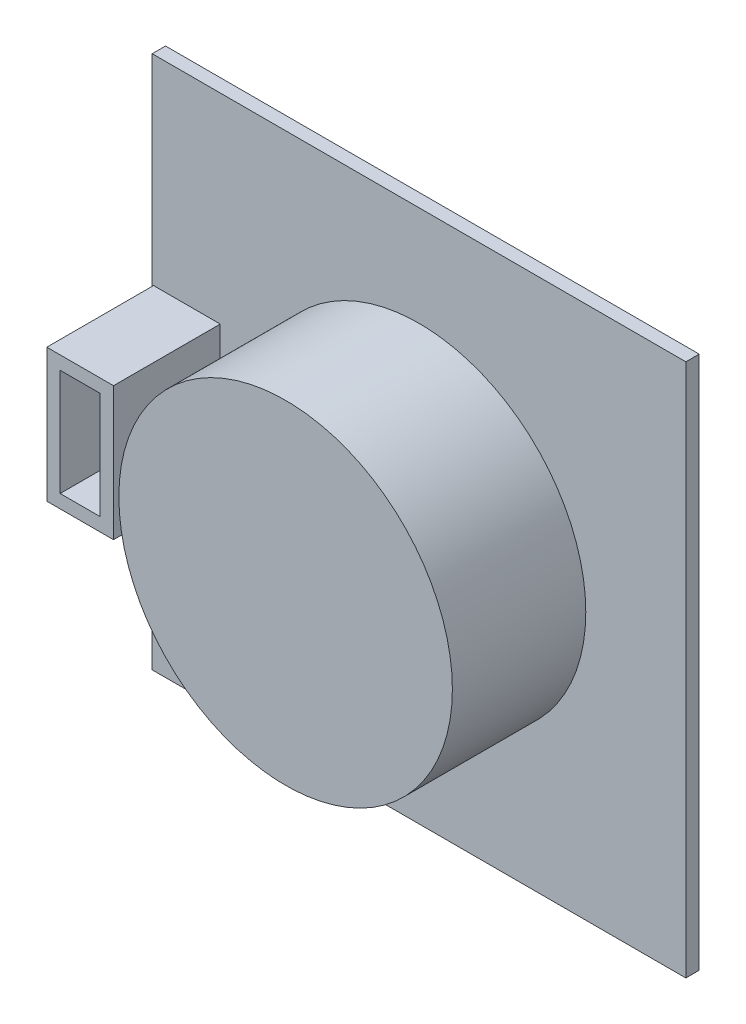
ISO-10303-21;
HEADER;
FILE_DESCRIPTION(('STEP AP214'),'2;1');
FILE_NAME('part.step','',(''),(''),'','','');
FILE_SCHEMA(('AUTOMOTIVE_DESIGN { 1 0 10303 214 1 1 1 1 }'));
ENDSEC;
DATA;
#1=APPLICATION_CONTEXT('core data for automotive mechanical design processes');
#2=APPLICATION_PROTOCOL_DEFINITION('international standard','automotive_design',2000,#1);
#3=PRODUCT_CONTEXT('',#1,'mechanical');
#4=PRODUCT('Part','Part','',(#3));
#5=PRODUCT_RELATED_PRODUCT_CATEGORY('part','',(#4));
#6=PRODUCT_DEFINITION_FORMATION('','',#4);
#7=PRODUCT_DEFINITION_CONTEXT('part definition',#1,'design');
#8=PRODUCT_DEFINITION('design','',#6,#7);
#9=PRODUCT_DEFINITION_SHAPE('','',#8);
#10=(LENGTH_UNIT() NAMED_UNIT(*) SI_UNIT(.MILLI.,.METRE.));
#11=(NAMED_UNIT(*) PLANE_ANGLE_UNIT() SI_UNIT($,.RADIAN.));
#12=(NAMED_UNIT(*) SI_UNIT($,.STERADIAN.) SOLID_ANGLE_UNIT());
#13=UNCERTAINTY_MEASURE_WITH_UNIT(LENGTH_MEASURE(1.E-05),#10,'distance_accuracy_value','');
#14=(GEOMETRIC_REPRESENTATION_CONTEXT(3) GLOBAL_UNCERTAINTY_ASSIGNED_CONTEXT((#13)) GLOBAL_UNIT_ASSIGNED_CONTEXT((#10,
#11,#12)) REPRESENTATION_CONTEXT('',''));
#15=CARTESIAN_POINT('',(0.,0.,0.));
#16=DIRECTION('',(0.,0.,1.));
#17=DIRECTION('',(1.,0.,0.));
#18=AXIS2_PLACEMENT_3D('',#15,#16,#17);
#19=CARTESIAN_POINT('',(0.,0.,0.1));
#20=DIRECTION('',(0.,0.,-1.));
#21=DIRECTION('',(-1.,0.,0.));
#22=AXIS2_PLACEMENT_3D('',#19,#20,#21);
#23=PLANE('',#22);
#24=DIRECTION('',(0.,-1.,0.));
#25=VECTOR('',#24,1.);
#26=CARTESIAN_POINT('',(0.,0.,0.1));
#27=LINE('',#26,#25);
#28=CARTESIAN_POINT('',(0.,4.,0.1));
#29=VERTEX_POINT('',#28);
#30=CARTESIAN_POINT('',(0.,0.,0.1));
#31=VERTEX_POINT('',#30);
#32=EDGE_CURVE('E201',#29,#31,#27,.T.);
#33=ORIENTED_EDGE('',*,*,#32,.T.);
#34=DIRECTION('',(1.,0.,0.));
#35=VECTOR('',#34,1.);
#36=CARTESIAN_POINT('',(0.,0.,0.1));
#37=LINE('',#36,#35);
#38=CARTESIAN_POINT('',(4.,0.,0.1));
#39=VERTEX_POINT('',#38);
#40=EDGE_CURVE('E204',#31,#39,#37,.T.);
#41=ORIENTED_EDGE('',*,*,#40,.T.);
#42=DIRECTION('',(0.,1.,0.));
#43=VECTOR('',#42,1.);
#44=CARTESIAN_POINT('',(4.,0.,0.1));
#45=LINE('',#44,#43);
#46=CARTESIAN_POINT('',(4.,4.,0.1));
#47=VERTEX_POINT('',#46);
#48=EDGE_CURVE('E207',#39,#47,#45,.T.);
#49=ORIENTED_EDGE('',*,*,#48,.T.);
#50=DIRECTION('',(-1.,0.,0.));
#51=VECTOR('',#50,1.);
#52=CARTESIAN_POINT('',(0.,4.,0.1));
#53=LINE('',#52,#51);
#54=EDGE_CURVE('E209',#47,#29,#53,.T.);
#55=ORIENTED_EDGE('',*,*,#54,.T.);
#56=EDGE_LOOP('',(#33,#41,#49,#55));
#57=FACE_BOUND('',#56,.T.);
#58=CARTESIAN_POINT('',(2.,2.,0.1));
#59=DIRECTION('',(0.,0.,1.));
#60=DIRECTION('',(1.,0.,0.));
#61=AXIS2_PLACEMENT_3D('',#58,#59,#60);
#62=CIRCLE('',#61,1.25);
#63=CARTESIAN_POINT('',(3.25,2.,0.1));
#64=VERTEX_POINT('',#63);
#65=EDGE_CURVE('E11',#64,#64,#62,.T.);
#66=ORIENTED_EDGE('',*,*,#65,.F.);
#67=EDGE_LOOP('',(#66));
#68=FACE_BOUND('',#67,.T.);
#69=DIRECTION('',(0.,-1.,0.));
#70=VECTOR('',#69,1.);
#71=CARTESIAN_POINT('',(0.01,2.5,0.1));
#72=LINE('',#71,#70);
#73=CARTESIAN_POINT('',(0.01,2.5,0.1));
#74=VERTEX_POINT('',#73);
#75=CARTESIAN_POINT('',(0.01,1.5,0.1));
#76=VERTEX_POINT('',#75);
#77=EDGE_CURVE('E164',#74,#76,#72,.T.);
#78=ORIENTED_EDGE('',*,*,#77,.F.);
#79=DIRECTION('',(-1.,0.,0.));
#80=VECTOR('',#79,1.);
#81=CARTESIAN_POINT('',(0.01,2.5,0.1));
#82=LINE('',#81,#80);
#83=CARTESIAN_POINT('',(0.51,2.5,0.1));
#84=VERTEX_POINT('',#83);
#85=EDGE_CURVE('E172',#84,#74,#82,.T.);
#86=ORIENTED_EDGE('',*,*,#85,.F.);
#87=DIRECTION('',(0.,1.,0.));
#88=VECTOR('',#87,1.);
#89=CARTESIAN_POINT('',(0.51,2.5,0.1));
#90=LINE('',#89,#88);
#91=CARTESIAN_POINT('',(0.51,1.5,0.1));
#92=VERTEX_POINT('',#91);
#93=EDGE_CURVE('E182',#92,#84,#90,.T.);
#94=ORIENTED_EDGE('',*,*,#93,.F.);
#95=DIRECTION('',(1.,0.,0.));
#96=VECTOR('',#95,1.);
#97=CARTESIAN_POINT('',(0.01,1.5,0.1));
#98=LINE('',#97,#96);
#99=EDGE_CURVE('E63',#76,#92,#98,.T.);
#100=ORIENTED_EDGE('',*,*,#99,.F.);
#101=EDGE_LOOP('',(#78,#86,#94,#100));
#102=FACE_BOUND('',#101,.T.);
#103=ADVANCED_FACE('F39',(#57,#68,#102),#23,.F.);
#104=CARTESIAN_POINT('',(0.,0.,0.1));
#105=DIRECTION('',(1.,0.,0.));
#106=DIRECTION('',(0.,0.,-1.));
#107=AXIS2_PLACEMENT_3D('',#104,#105,#106);
#108=PLANE('',#107);
#109=DIRECTION('',(0.,-1.,0.));
#110=VECTOR('',#109,1.);
#111=CARTESIAN_POINT('',(0.,0.,0.));
#112=LINE('',#111,#110);
#113=CARTESIAN_POINT('',(0.,4.,0.));
#114=VERTEX_POINT('',#113);
#115=CARTESIAN_POINT('',(0.,0.,0.));
#116=VERTEX_POINT('',#115);
#117=EDGE_CURVE('E199',#114,#116,#112,.T.);
#118=ORIENTED_EDGE('',*,*,#117,.T.);
#119=DIRECTION('',(0.,0.,-1.));
#120=VECTOR('',#119,1.);
#121=CARTESIAN_POINT('',(0.,0.,0.1));
#122=LINE('',#121,#120);
#123=EDGE_CURVE('E43',#31,#116,#122,.T.);
#124=ORIENTED_EDGE('',*,*,#123,.F.);
#125=ORIENTED_EDGE('',*,*,#32,.F.);
#126=DIRECTION('',(0.,0.,-1.));
#127=VECTOR('',#126,1.);
#128=CARTESIAN_POINT('',(0.,4.,0.1));
#129=LINE('',#128,#127);
#130=EDGE_CURVE('E211',#29,#114,#129,.T.);
#131=ORIENTED_EDGE('',*,*,#130,.T.);
#132=EDGE_LOOP('',(#118,#124,#125,#131));
#133=FACE_BOUND('',#132,.T.);
#134=ADVANCED_FACE('F41',(#133),#108,.F.);
#135=CARTESIAN_POINT('',(0.,0.,0.1));
#136=DIRECTION('',(0.,1.,0.));
#137=DIRECTION('',(0.,0.,1.));
#138=AXIS2_PLACEMENT_3D('',#135,#136,#137);
#139=PLANE('',#138);
#140=DIRECTION('',(1.,0.,0.));
#141=VECTOR('',#140,1.);
#142=CARTESIAN_POINT('',(0.,0.,0.));
#143=LINE('',#142,#141);
#144=CARTESIAN_POINT('',(4.,0.,0.));
#145=VERTEX_POINT('',#144);
#146=EDGE_CURVE('E214',#116,#145,#143,.T.);
#147=ORIENTED_EDGE('',*,*,#146,.T.);
#148=DIRECTION('',(0.,0.,-1.));
#149=VECTOR('',#148,1.);
#150=CARTESIAN_POINT('',(4.,0.,0.1));
#151=LINE('',#150,#149);
#152=EDGE_CURVE('E223',#39,#145,#151,.T.);
#153=ORIENTED_EDGE('',*,*,#152,.F.);
#154=ORIENTED_EDGE('',*,*,#40,.F.);
#155=ORIENTED_EDGE('',*,*,#123,.T.);
#156=EDGE_LOOP('',(#147,#153,#154,#155));
#157=FACE_BOUND('',#156,.T.);
#158=ADVANCED_FACE('F232',(#157),#139,.F.);
#159=CARTESIAN_POINT('',(4.,0.,0.1));
#160=DIRECTION('',(-1.,0.,0.));
#161=DIRECTION('',(0.,0.,1.));
#162=AXIS2_PLACEMENT_3D('',#159,#160,#161);
#163=PLANE('',#162);
#164=DIRECTION('',(0.,1.,0.));
#165=VECTOR('',#164,1.);
#166=CARTESIAN_POINT('',(4.,0.,0.));
#167=LINE('',#166,#165);
#168=CARTESIAN_POINT('',(4.,4.,0.));
#169=VERTEX_POINT('',#168);
#170=EDGE_CURVE('E216',#145,#169,#167,.T.);
#171=ORIENTED_EDGE('',*,*,#170,.T.);
#172=DIRECTION('',(0.,0.,-1.));
#173=VECTOR('',#172,1.);
#174=CARTESIAN_POINT('',(4.,4.,0.1));
#175=LINE('',#174,#173);
#176=EDGE_CURVE('E221',#47,#169,#175,.T.);
#177=ORIENTED_EDGE('',*,*,#176,.F.);
#178=ORIENTED_EDGE('',*,*,#48,.F.);
#179=ORIENTED_EDGE('',*,*,#152,.T.);
#180=EDGE_LOOP('',(#171,#177,#178,#179));
#181=FACE_BOUND('',#180,.T.);
#182=ADVANCED_FACE('F241',(#181),#163,.F.);
#183=CARTESIAN_POINT('',(0.,4.,0.1));
#184=DIRECTION('',(0.,-1.,0.));
#185=DIRECTION('',(0.,0.,-1.));
#186=AXIS2_PLACEMENT_3D('',#183,#184,#185);
#187=PLANE('',#186);
#188=DIRECTION('',(-1.,0.,0.));
#189=VECTOR('',#188,1.);
#190=CARTESIAN_POINT('',(0.,4.,0.));
#191=LINE('',#190,#189);
#192=EDGE_CURVE('E205',#169,#114,#191,.T.);
#193=ORIENTED_EDGE('',*,*,#192,.T.);
#194=ORIENTED_EDGE('',*,*,#130,.F.);
#195=ORIENTED_EDGE('',*,*,#54,.F.);
#196=ORIENTED_EDGE('',*,*,#176,.T.);
#197=EDGE_LOOP('',(#193,#194,#195,#196));
#198=FACE_BOUND('',#197,.T.);
#199=ADVANCED_FACE('F244',(#198),#187,.F.);
#200=CARTESIAN_POINT('',(0.,0.,0.));
#201=DIRECTION('',(0.,0.,-1.));
#202=DIRECTION('',(-1.,0.,0.));
#203=AXIS2_PLACEMENT_3D('',#200,#201,#202);
#204=PLANE('',#203);
#205=ORIENTED_EDGE('',*,*,#117,.F.);
#206=ORIENTED_EDGE('',*,*,#192,.F.);
#207=ORIENTED_EDGE('',*,*,#170,.F.);
#208=ORIENTED_EDGE('',*,*,#146,.F.);
#209=EDGE_LOOP('',(#205,#206,#207,#208));
#210=FACE_BOUND('',#209,.T.);
#211=ADVANCED_FACE('F239',(#210),#204,.T.);
#212=CARTESIAN_POINT('',(2.,2.,1.1));
#213=DIRECTION('',(0.,0.,-1.));
#214=DIRECTION('',(-1.,0.,0.));
#215=AXIS2_PLACEMENT_3D('',#212,#213,#214);
#216=CYLINDRICAL_SURFACE('',#215,1.25);
#217=CARTESIAN_POINT('',(2.,2.,1.1));
#218=DIRECTION('',(0.,0.,1.));
#219=DIRECTION('',(1.,0.,0.));
#220=AXIS2_PLACEMENT_3D('',#217,#218,#219);
#221=CIRCLE('',#220,1.25);
#222=CARTESIAN_POINT('',(3.25,2.,1.1));
#223=VERTEX_POINT('',#222);
#224=EDGE_CURVE('E197',#223,#223,#221,.T.);
#225=ORIENTED_EDGE('',*,*,#224,.F.);
#226=EDGE_LOOP('',(#225));
#227=FACE_BOUND('',#226,.T.);
#228=ORIENTED_EDGE('',*,*,#65,.T.);
#229=EDGE_LOOP('',(#228));
#230=FACE_BOUND('',#229,.T.);
#231=ADVANCED_FACE('F280',(#227,#230),#216,.T.);
#232=CARTESIAN_POINT('',(2.,2.,1.1));
#233=DIRECTION('',(0.,0.,1.));
#234=DIRECTION('',(1.,0.,0.));
#235=AXIS2_PLACEMENT_3D('',#232,#233,#234);
#236=PLANE('',#235);
#237=ORIENTED_EDGE('',*,*,#224,.T.);
#238=EDGE_LOOP('',(#237));
#239=FACE_BOUND('',#238,.T.);
#240=ADVANCED_FACE('F274',(#239),#236,.T.);
#241=CARTESIAN_POINT('',(0.01,2.5,0.9));
#242=DIRECTION('',(1.,0.,0.));
#243=DIRECTION('',(0.,0.,-1.));
#244=AXIS2_PLACEMENT_3D('',#241,#242,#243);
#245=PLANE('',#244);
#246=ORIENTED_EDGE('',*,*,#77,.T.);
#247=DIRECTION('',(0.,0.,-1.));
#248=VECTOR('',#247,1.);
#249=CARTESIAN_POINT('',(0.01,1.5,0.9));
#250=LINE('',#249,#248);
#251=CARTESIAN_POINT('',(0.01,1.5,0.9));
#252=VERTEX_POINT('',#251);
#253=EDGE_CURVE('E195',#252,#76,#250,.T.);
#254=ORIENTED_EDGE('',*,*,#253,.F.);
#255=DIRECTION('',(0.,-1.,0.));
#256=VECTOR('',#255,1.);
#257=CARTESIAN_POINT('',(0.01,2.5,0.9));
#258=LINE('',#257,#256);
#259=CARTESIAN_POINT('',(0.01,2.5,0.9));
#260=VERTEX_POINT('',#259);
#261=EDGE_CURVE('E168',#260,#252,#258,.T.);
#262=ORIENTED_EDGE('',*,*,#261,.F.);
#263=DIRECTION('',(0.,0.,-1.));
#264=VECTOR('',#263,1.);
#265=CARTESIAN_POINT('',(0.01,2.5,0.9));
#266=LINE('',#265,#264);
#267=EDGE_CURVE('E178',#260,#74,#266,.T.);
#268=ORIENTED_EDGE('',*,*,#267,.T.);
#269=EDGE_LOOP('',(#246,#254,#262,#268));
#270=FACE_BOUND('',#269,.T.);
#271=ADVANCED_FACE('F258',(#270),#245,.F.);
#272=CARTESIAN_POINT('',(0.01,1.5,0.9));
#273=DIRECTION('',(0.,1.,0.));
#274=DIRECTION('',(0.,0.,1.));
#275=AXIS2_PLACEMENT_3D('',#272,#273,#274);
#276=PLANE('',#275);
#277=ORIENTED_EDGE('',*,*,#99,.T.);
#278=DIRECTION('',(0.,0.,-1.));
#279=VECTOR('',#278,1.);
#280=CARTESIAN_POINT('',(0.51,1.5,0.9));
#281=LINE('',#280,#279);
#282=CARTESIAN_POINT('',(0.51,1.5,0.9));
#283=VERTEX_POINT('',#282);
#284=EDGE_CURVE('E192',#283,#92,#281,.T.);
#285=ORIENTED_EDGE('',*,*,#284,.F.);
#286=DIRECTION('',(1.,0.,0.));
#287=VECTOR('',#286,1.);
#288=CARTESIAN_POINT('',(0.01,1.5,0.9));
#289=LINE('',#288,#287);
#290=EDGE_CURVE('E171',#252,#283,#289,.T.);
#291=ORIENTED_EDGE('',*,*,#290,.F.);
#292=ORIENTED_EDGE('',*,*,#253,.T.);
#293=EDGE_LOOP('',(#277,#285,#291,#292));
#294=FACE_BOUND('',#293,.T.);
#295=ADVANCED_FACE('F266',(#294),#276,.F.);
#296=CARTESIAN_POINT('',(0.51,2.5,0.9));
#297=DIRECTION('',(-1.,0.,0.));
#298=DIRECTION('',(0.,0.,1.));
#299=AXIS2_PLACEMENT_3D('',#296,#297,#298);
#300=PLANE('',#299);
#301=ORIENTED_EDGE('',*,*,#93,.T.);
#302=DIRECTION('',(0.,0.,-1.));
#303=VECTOR('',#302,1.);
#304=CARTESIAN_POINT('',(0.51,2.5,0.9));
#305=LINE('',#304,#303);
#306=CARTESIAN_POINT('',(0.51,2.5,0.9));
#307=VERTEX_POINT('',#306);
#308=EDGE_CURVE('E189',#307,#84,#305,.T.);
#309=ORIENTED_EDGE('',*,*,#308,.F.);
#310=DIRECTION('',(0.,1.,0.));
#311=VECTOR('',#310,1.);
#312=CARTESIAN_POINT('',(0.51,2.5,0.9));
#313=LINE('',#312,#311);
#314=EDGE_CURVE('E174',#283,#307,#313,.T.);
#315=ORIENTED_EDGE('',*,*,#314,.F.);
#316=ORIENTED_EDGE('',*,*,#284,.T.);
#317=EDGE_LOOP('',(#301,#309,#315,#316));
#318=FACE_BOUND('',#317,.T.);
#319=ADVANCED_FACE('F264',(#318),#300,.F.);
#320=CARTESIAN_POINT('',(0.01,2.5,0.9));
#321=DIRECTION('',(0.,-1.,0.));
#322=DIRECTION('',(0.,0.,-1.));
#323=AXIS2_PLACEMENT_3D('',#320,#321,#322);
#324=PLANE('',#323);
#325=ORIENTED_EDGE('',*,*,#85,.T.);
#326=ORIENTED_EDGE('',*,*,#267,.F.);
#327=DIRECTION('',(-1.,0.,0.));
#328=VECTOR('',#327,1.);
#329=CARTESIAN_POINT('',(0.01,2.5,0.9));
#330=LINE('',#329,#328);
#331=EDGE_CURVE('E176',#307,#260,#330,.T.);
#332=ORIENTED_EDGE('',*,*,#331,.F.);
#333=ORIENTED_EDGE('',*,*,#308,.T.);
#334=EDGE_LOOP('',(#325,#326,#332,#333));
#335=FACE_BOUND('',#334,.T.);
#336=ADVANCED_FACE('F254',(#335),#324,.F.);
#337=CARTESIAN_POINT('',(0.,0.,0.9));
#338=DIRECTION('',(0.,0.,1.));
#339=DIRECTION('',(1.,0.,0.));
#340=AXIS2_PLACEMENT_3D('',#337,#338,#339);
#341=PLANE('',#340);
#342=DIRECTION('',(0.,-1.,0.));
#343=VECTOR('',#342,1.);
#344=CARTESIAN_POINT('',(0.11,2.4,0.9));
#345=LINE('',#344,#343);
#346=CARTESIAN_POINT('',(0.11,2.4,0.9));
#347=VERTEX_POINT('',#346);
#348=CARTESIAN_POINT('',(0.11,1.6,0.9));
#349=VERTEX_POINT('',#348);
#350=EDGE_CURVE('E55',#347,#349,#345,.T.);
#351=ORIENTED_EDGE('',*,*,#350,.F.);
#352=DIRECTION('',(-1.,0.,0.));
#353=VECTOR('',#352,1.);
#354=CARTESIAN_POINT('',(0.11,2.4,0.9));
#355=LINE('',#354,#353);
#356=CARTESIAN_POINT('',(0.409566549273762,2.4,0.9));
#357=VERTEX_POINT('',#356);
#358=EDGE_CURVE('E149',#357,#347,#355,.T.);
#359=ORIENTED_EDGE('',*,*,#358,.F.);
#360=DIRECTION('',(0.,1.,0.));
#361=VECTOR('',#360,1.);
#362=CARTESIAN_POINT('',(0.409566549273762,2.4,0.9));
#363=LINE('',#362,#361);
#364=CARTESIAN_POINT('',(0.409566549273762,1.6,0.9));
#365=VERTEX_POINT('',#364);
#366=EDGE_CURVE('E152',#365,#357,#363,.T.);
#367=ORIENTED_EDGE('',*,*,#366,.F.);
#368=DIRECTION('',(1.,0.,0.));
#369=VECTOR('',#368,1.);
#370=CARTESIAN_POINT('',(0.11,1.6,0.9));
#371=LINE('',#370,#369);
#372=EDGE_CURVE('E158',#349,#365,#371,.T.);
#373=ORIENTED_EDGE('',*,*,#372,.F.);
#374=EDGE_LOOP('',(#351,#359,#367,#373));
#375=FACE_BOUND('',#374,.T.);
#376=ORIENTED_EDGE('',*,*,#261,.T.);
#377=ORIENTED_EDGE('',*,*,#290,.T.);
#378=ORIENTED_EDGE('',*,*,#314,.T.);
#379=ORIENTED_EDGE('',*,*,#331,.T.);
#380=EDGE_LOOP('',(#376,#377,#378,#379));
#381=FACE_BOUND('',#380,.T.);
#382=ADVANCED_FACE('F260',(#375,#381),#341,.T.);
#383=CARTESIAN_POINT('',(0.11,2.4,0.2));
#384=DIRECTION('',(-1.,0.,0.));
#385=DIRECTION('',(0.,-1.,0.));
#386=AXIS2_PLACEMENT_3D('',#383,#384,#385);
#387=PLANE('',#386);
#388=ORIENTED_EDGE('',*,*,#350,.T.);
#389=DIRECTION('',(0.,0.,1.));
#390=VECTOR('',#389,1.);
#391=CARTESIAN_POINT('',(0.11,1.6,0.2));
#392=LINE('',#391,#390);
#393=CARTESIAN_POINT('',(0.11,1.6,0.2));
#394=VERTEX_POINT('',#393);
#395=EDGE_CURVE('E127',#394,#349,#392,.T.);
#396=ORIENTED_EDGE('',*,*,#395,.F.);
#397=DIRECTION('',(0.,-1.,0.));
#398=VECTOR('',#397,1.);
#399=CARTESIAN_POINT('',(0.11,2.4,0.2));
#400=LINE('',#399,#398);
#401=CARTESIAN_POINT('',(0.11,2.4,0.2));
#402=VERTEX_POINT('',#401);
#403=EDGE_CURVE('E131',#402,#394,#400,.T.);
#404=ORIENTED_EDGE('',*,*,#403,.F.);
#405=DIRECTION('',(0.,0.,1.));
#406=VECTOR('',#405,1.);
#407=CARTESIAN_POINT('',(0.11,2.4,0.2));
#408=LINE('',#407,#406);
#409=EDGE_CURVE('E162',#402,#347,#408,.T.);
#410=ORIENTED_EDGE('',*,*,#409,.T.);
#411=EDGE_LOOP('',(#388,#396,#404,#410));
#412=FACE_BOUND('',#411,.T.);
#413=ADVANCED_FACE('F129',(#412),#387,.F.);
#414=CARTESIAN_POINT('',(0.11,2.4,0.2));
#415=DIRECTION('',(0.,1.,0.));
#416=DIRECTION('',(0.,0.,1.));
#417=AXIS2_PLACEMENT_3D('',#414,#415,#416);
#418=PLANE('',#417);
#419=ORIENTED_EDGE('',*,*,#358,.T.);
#420=ORIENTED_EDGE('',*,*,#409,.F.);
#421=DIRECTION('',(-1.,0.,0.));
#422=VECTOR('',#421,1.);
#423=CARTESIAN_POINT('',(0.11,2.4,0.2));
#424=LINE('',#423,#422);
#425=CARTESIAN_POINT('',(0.409566549273762,2.4,0.2));
#426=VERTEX_POINT('',#425);
#427=EDGE_CURVE('E137',#426,#402,#424,.T.);
#428=ORIENTED_EDGE('',*,*,#427,.F.);
#429=DIRECTION('',(0.,0.,1.));
#430=VECTOR('',#429,1.);
#431=CARTESIAN_POINT('',(0.409566549273762,2.4,0.2));
#432=LINE('',#431,#430);
#433=EDGE_CURVE('E165',#426,#357,#432,.T.);
#434=ORIENTED_EDGE('',*,*,#433,.T.);
#435=EDGE_LOOP('',(#419,#420,#428,#434));
#436=FACE_BOUND('',#435,.T.);
#437=ADVANCED_FACE('F426',(#436),#418,.F.);
#438=CARTESIAN_POINT('',(0.409566549273762,2.4,0.2));
#439=DIRECTION('',(1.,0.,0.));
#440=DIRECTION('',(0.,1.,0.));
#441=AXIS2_PLACEMENT_3D('',#438,#439,#440);
#442=PLANE('',#441);
#443=ORIENTED_EDGE('',*,*,#366,.T.);
#444=ORIENTED_EDGE('',*,*,#433,.F.);
#445=DIRECTION('',(0.,1.,0.));
#446=VECTOR('',#445,1.);
#447=CARTESIAN_POINT('',(0.409566549273762,2.4,0.2));
#448=LINE('',#447,#446);
#449=CARTESIAN_POINT('',(0.409566549273762,1.6,0.2));
#450=VERTEX_POINT('',#449);
#451=EDGE_CURVE('E145',#450,#426,#448,.T.);
#452=ORIENTED_EDGE('',*,*,#451,.F.);
#453=DIRECTION('',(0.,0.,1.));
#454=VECTOR('',#453,1.);
#455=CARTESIAN_POINT('',(0.409566549273762,1.6,0.2));
#456=LINE('',#455,#454);
#457=EDGE_CURVE('E136',#450,#365,#456,.T.);
#458=ORIENTED_EDGE('',*,*,#457,.T.);
#459=EDGE_LOOP('',(#443,#444,#452,#458));
#460=FACE_BOUND('',#459,.T.);
#461=ADVANCED_FACE('F436',(#460),#442,.F.);
#462=CARTESIAN_POINT('',(0.11,1.6,0.2));
#463=DIRECTION('',(0.,-1.,0.));
#464=DIRECTION('',(0.,0.,-1.));
#465=AXIS2_PLACEMENT_3D('',#462,#463,#464);
#466=PLANE('',#465);
#467=ORIENTED_EDGE('',*,*,#372,.T.);
#468=ORIENTED_EDGE('',*,*,#457,.F.);
#469=DIRECTION('',(1.,0.,0.));
#470=VECTOR('',#469,1.);
#471=CARTESIAN_POINT('',(0.11,1.6,0.2));
#472=LINE('',#471,#470);
#473=EDGE_CURVE('E140',#394,#450,#472,.T.);
#474=ORIENTED_EDGE('',*,*,#473,.F.);
#475=ORIENTED_EDGE('',*,*,#395,.T.);
#476=EDGE_LOOP('',(#467,#468,#474,#475));
#477=FACE_BOUND('',#476,.T.);
#478=ADVANCED_FACE('F141',(#477),#466,.F.);
#479=CARTESIAN_POINT('',(0.,0.,0.2));
#480=DIRECTION('',(0.,0.,1.));
#481=DIRECTION('',(1.,0.,0.));
#482=AXIS2_PLACEMENT_3D('',#479,#480,#481);
#483=PLANE('',#482);
#484=ORIENTED_EDGE('',*,*,#403,.T.);
#485=ORIENTED_EDGE('',*,*,#473,.T.);
#486=ORIENTED_EDGE('',*,*,#451,.T.);
#487=ORIENTED_EDGE('',*,*,#427,.T.);
#488=EDGE_LOOP('',(#484,#485,#486,#487));
#489=FACE_BOUND('',#488,.T.);
#490=ADVANCED_FACE('F147',(#489),#483,.T.);
#491=CLOSED_SHELL('',(#103,#134,#158,#182,#199,#211,#231,#240,#271,#295,#319,#336,#382,#413,
#437,#461,#478,#490));
#492=MANIFOLD_SOLID_BREP('B2',#491);
#493=ADVANCED_BREP_SHAPE_REPRESENTATION('',(#18,#492),#14);
#494=SHAPE_DEFINITION_REPRESENTATION(#9,#493);
ENDSEC;
END-ISO-10303-21;
